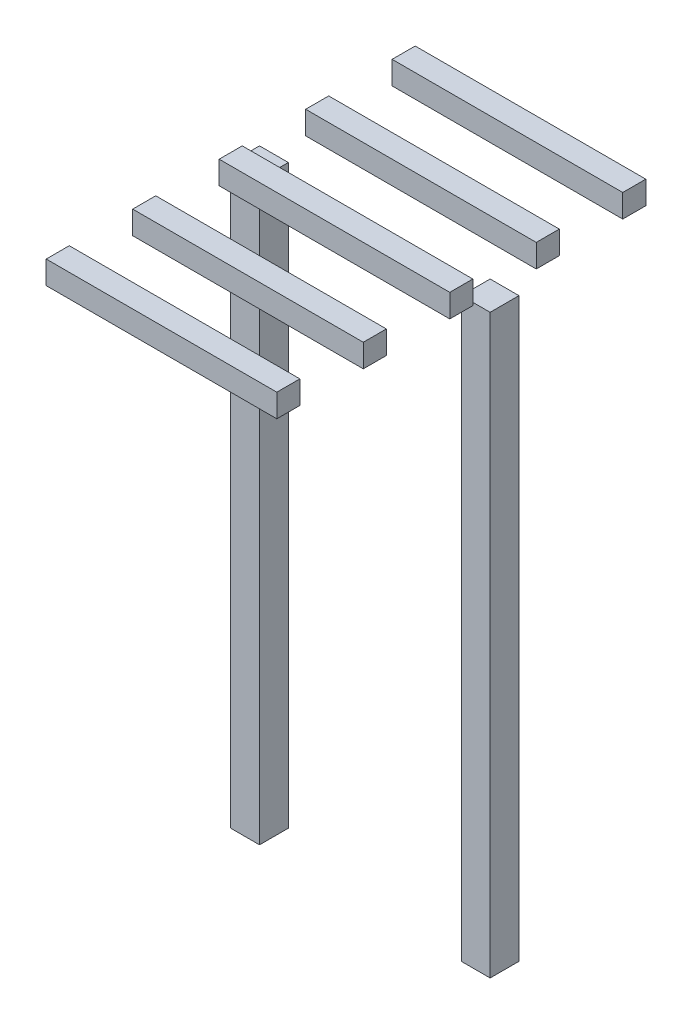
ISO-10303-21;
HEADER;
FILE_DESCRIPTION(('STEP AP214'),'2;1');
FILE_NAME('part.step','',(''),(''),'','','');
FILE_SCHEMA(('AUTOMOTIVE_DESIGN { 1 0 10303 214 1 1 1 1 }'));
ENDSEC;
DATA;
#1=APPLICATION_CONTEXT('core data for automotive mechanical design processes');
#2=APPLICATION_PROTOCOL_DEFINITION('international standard','automotive_design',2000,#1);
#3=PRODUCT_CONTEXT('',#1,'mechanical');
#4=PRODUCT('Part','Part','',(#3));
#5=PRODUCT_RELATED_PRODUCT_CATEGORY('part','',(#4));
#6=PRODUCT_DEFINITION_FORMATION('','',#4);
#7=PRODUCT_DEFINITION_CONTEXT('part definition',#1,'design');
#8=PRODUCT_DEFINITION('design','',#6,#7);
#9=PRODUCT_DEFINITION_SHAPE('','',#8);
#10=(LENGTH_UNIT() NAMED_UNIT(*) SI_UNIT(.MILLI.,.METRE.));
#11=(NAMED_UNIT(*) PLANE_ANGLE_UNIT() SI_UNIT($,.RADIAN.));
#12=(NAMED_UNIT(*) SI_UNIT($,.STERADIAN.) SOLID_ANGLE_UNIT());
#13=UNCERTAINTY_MEASURE_WITH_UNIT(LENGTH_MEASURE(1.E-05),#10,'distance_accuracy_value','');
#14=(GEOMETRIC_REPRESENTATION_CONTEXT(3) GLOBAL_UNCERTAINTY_ASSIGNED_CONTEXT((#13)) GLOBAL_UNIT_ASSIGNED_CONTEXT((#10,
#11,#12)) REPRESENTATION_CONTEXT('',''));
#15=CARTESIAN_POINT('',(0.,0.,0.));
#16=DIRECTION('',(0.,0.,1.));
#17=DIRECTION('',(1.,0.,0.));
#18=AXIS2_PLACEMENT_3D('',#15,#16,#17);
#19=CARTESIAN_POINT('',(400.,2080.,-1460.));
#20=DIRECTION('',(-1.,0.,0.));
#21=DIRECTION('',(0.,0.,1.));
#22=AXIS2_PLACEMENT_3D('',#19,#20,#21);
#23=PLANE('',#22);
#24=DIRECTION('',(0.,0.,-1.));
#25=VECTOR('',#24,1.);
#26=CARTESIAN_POINT('',(400.,2000.,-1460.));
#27=LINE('',#26,#25);
#28=CARTESIAN_POINT('',(400.,2000.,-1460.));
#29=VERTEX_POINT('',#28);
#30=CARTESIAN_POINT('',(400.,2000.,-1540.));
#31=VERTEX_POINT('',#30);
#32=EDGE_CURVE('E115',#29,#31,#27,.T.);
#33=ORIENTED_EDGE('',*,*,#32,.T.);
#34=DIRECTION('',(0.,-1.,0.));
#35=VECTOR('',#34,1.);
#36=CARTESIAN_POINT('',(400.,2080.,-1540.));
#37=LINE('',#36,#35);
#38=CARTESIAN_POINT('',(400.,2080.,-1540.));
#39=VERTEX_POINT('',#38);
#40=EDGE_CURVE('E12',#39,#31,#37,.T.);
#41=ORIENTED_EDGE('',*,*,#40,.F.);
#42=DIRECTION('',(0.,0.,-1.));
#43=VECTOR('',#42,1.);
#44=CARTESIAN_POINT('',(400.,2080.,-1460.));
#45=LINE('',#44,#43);
#46=CARTESIAN_POINT('',(400.,2080.,-1460.));
#47=VERTEX_POINT('',#46);
#48=EDGE_CURVE('E103',#47,#39,#45,.T.);
#49=ORIENTED_EDGE('',*,*,#48,.F.);
#50=DIRECTION('',(0.,-1.,0.));
#51=VECTOR('',#50,1.);
#52=CARTESIAN_POINT('',(400.,2080.,-1460.));
#53=LINE('',#52,#51);
#54=EDGE_CURVE('E111',#47,#29,#53,.T.);
#55=ORIENTED_EDGE('',*,*,#54,.T.);
#56=EDGE_LOOP('',(#33,#41,#49,#55));
#57=FACE_BOUND('',#56,.T.);
#58=ADVANCED_FACE('F52',(#57),#23,.F.);
#59=CARTESIAN_POINT('',(-400.,2080.,-1540.));
#60=DIRECTION('',(0.,0.,1.));
#61=DIRECTION('',(1.,0.,0.));
#62=AXIS2_PLACEMENT_3D('',#59,#60,#61);
#63=PLANE('',#62);
#64=DIRECTION('',(-1.,0.,0.));
#65=VECTOR('',#64,1.);
#66=CARTESIAN_POINT('',(-400.,2000.,-1540.));
#67=LINE('',#66,#65);
#68=CARTESIAN_POINT('',(-400.,2000.,-1540.));
#69=VERTEX_POINT('',#68);
#70=EDGE_CURVE('E107',#31,#69,#67,.T.);
#71=ORIENTED_EDGE('',*,*,#70,.T.);
#72=DIRECTION('',(0.,-1.,0.));
#73=VECTOR('',#72,1.);
#74=CARTESIAN_POINT('',(-400.,2080.,-1540.));
#75=LINE('',#74,#73);
#76=CARTESIAN_POINT('',(-400.,2080.,-1540.));
#77=VERTEX_POINT('',#76);
#78=EDGE_CURVE('E60',#77,#69,#75,.T.);
#79=ORIENTED_EDGE('',*,*,#78,.F.);
#80=DIRECTION('',(-1.,0.,0.));
#81=VECTOR('',#80,1.);
#82=CARTESIAN_POINT('',(-400.,2080.,-1540.));
#83=LINE('',#82,#81);
#84=EDGE_CURVE('E98',#39,#77,#83,.T.);
#85=ORIENTED_EDGE('',*,*,#84,.F.);
#86=ORIENTED_EDGE('',*,*,#40,.T.);
#87=EDGE_LOOP('',(#71,#79,#85,#86));
#88=FACE_BOUND('',#87,.T.);
#89=ADVANCED_FACE('F106',(#88),#63,.F.);
#90=CARTESIAN_POINT('',(-400.,2080.,-1460.));
#91=DIRECTION('',(1.,0.,0.));
#92=DIRECTION('',(0.,0.,-1.));
#93=AXIS2_PLACEMENT_3D('',#90,#91,#92);
#94=PLANE('',#93);
#95=DIRECTION('',(0.,0.,1.));
#96=VECTOR('',#95,1.);
#97=CARTESIAN_POINT('',(-400.,2000.,-1460.));
#98=LINE('',#97,#96);
#99=CARTESIAN_POINT('',(-400.,2000.,-1460.));
#100=VERTEX_POINT('',#99);
#101=EDGE_CURVE('E85',#69,#100,#98,.T.);
#102=ORIENTED_EDGE('',*,*,#101,.T.);
#103=DIRECTION('',(0.,-1.,0.));
#104=VECTOR('',#103,1.);
#105=CARTESIAN_POINT('',(-400.,2080.,-1460.));
#106=LINE('',#105,#104);
#107=CARTESIAN_POINT('',(-400.,2080.,-1460.));
#108=VERTEX_POINT('',#107);
#109=EDGE_CURVE('E108',#108,#100,#106,.T.);
#110=ORIENTED_EDGE('',*,*,#109,.F.);
#111=DIRECTION('',(0.,0.,1.));
#112=VECTOR('',#111,1.);
#113=CARTESIAN_POINT('',(-400.,2080.,-1460.));
#114=LINE('',#113,#112);
#115=EDGE_CURVE('E101',#77,#108,#114,.T.);
#116=ORIENTED_EDGE('',*,*,#115,.F.);
#117=ORIENTED_EDGE('',*,*,#78,.T.);
#118=EDGE_LOOP('',(#102,#110,#116,#117));
#119=FACE_BOUND('',#118,.T.);
#120=ADVANCED_FACE('F109',(#119),#94,.F.);
#121=CARTESIAN_POINT('',(-400.,2080.,-1460.));
#122=DIRECTION('',(0.,0.,-1.));
#123=DIRECTION('',(-1.,0.,0.));
#124=AXIS2_PLACEMENT_3D('',#121,#122,#123);
#125=PLANE('',#124);
#126=DIRECTION('',(1.,0.,0.));
#127=VECTOR('',#126,1.);
#128=CARTESIAN_POINT('',(-400.,2000.,-1460.));
#129=LINE('',#128,#127);
#130=EDGE_CURVE('E91',#100,#29,#129,.T.);
#131=ORIENTED_EDGE('',*,*,#130,.T.);
#132=ORIENTED_EDGE('',*,*,#54,.F.);
#133=DIRECTION('',(1.,0.,0.));
#134=VECTOR('',#133,1.);
#135=CARTESIAN_POINT('',(-400.,2080.,-1460.));
#136=LINE('',#135,#134);
#137=EDGE_CURVE('E68',#108,#47,#136,.T.);
#138=ORIENTED_EDGE('',*,*,#137,.F.);
#139=ORIENTED_EDGE('',*,*,#109,.T.);
#140=EDGE_LOOP('',(#131,#132,#138,#139));
#141=FACE_BOUND('',#140,.T.);
#142=ADVANCED_FACE('F122',(#141),#125,.F.);
#143=CARTESIAN_POINT('',(0.,2080.,0.));
#144=DIRECTION('',(0.,-1.,0.));
#145=DIRECTION('',(0.,0.,-1.));
#146=AXIS2_PLACEMENT_3D('',#143,#144,#145);
#147=PLANE('',#146);
#148=ORIENTED_EDGE('',*,*,#48,.T.);
#149=ORIENTED_EDGE('',*,*,#84,.T.);
#150=ORIENTED_EDGE('',*,*,#115,.T.);
#151=ORIENTED_EDGE('',*,*,#137,.T.);
#152=EDGE_LOOP('',(#148,#149,#150,#151));
#153=FACE_BOUND('',#152,.T.);
#154=ADVANCED_FACE('F99',(#153),#147,.F.);
#155=CARTESIAN_POINT('',(0.,2000.,0.));
#156=DIRECTION('',(0.,-1.,0.));
#157=DIRECTION('',(0.,0.,-1.));
#158=AXIS2_PLACEMENT_3D('',#155,#156,#157);
#159=PLANE('',#158);
#160=ORIENTED_EDGE('',*,*,#32,.F.);
#161=ORIENTED_EDGE('',*,*,#130,.F.);
#162=ORIENTED_EDGE('',*,*,#101,.F.);
#163=ORIENTED_EDGE('',*,*,#70,.F.);
#164=EDGE_LOOP('',(#160,#161,#162,#163));
#165=FACE_BOUND('',#164,.T.);
#166=ADVANCED_FACE('F125',(#165),#159,.T.);
#167=CLOSED_SHELL('',(#58,#89,#120,#142,#154,#166));
#168=MANIFOLD_SOLID_BREP('B2',#167);
#169=CARTESIAN_POINT('',(400.,2080.,-1160.));
#170=DIRECTION('',(-1.,0.,0.));
#171=DIRECTION('',(0.,0.,1.));
#172=AXIS2_PLACEMENT_3D('',#169,#170,#171);
#173=PLANE('',#172);
#174=DIRECTION('',(0.,0.,-1.));
#175=VECTOR('',#174,1.);
#176=CARTESIAN_POINT('',(400.,2000.,-1160.));
#177=LINE('',#176,#175);
#178=CARTESIAN_POINT('',(400.,2000.,-1160.));
#179=VERTEX_POINT('',#178);
#180=CARTESIAN_POINT('',(400.,2000.,-1240.));
#181=VERTEX_POINT('',#180);
#182=EDGE_CURVE('E249',#179,#181,#177,.T.);
#183=ORIENTED_EDGE('',*,*,#182,.T.);
#184=DIRECTION('',(0.,-1.,0.));
#185=VECTOR('',#184,1.);
#186=CARTESIAN_POINT('',(400.,2080.,-1240.));
#187=LINE('',#186,#185);
#188=CARTESIAN_POINT('',(400.,2080.,-1240.));
#189=VERTEX_POINT('',#188);
#190=EDGE_CURVE('E50',#189,#181,#187,.T.);
#191=ORIENTED_EDGE('',*,*,#190,.F.);
#192=DIRECTION('',(0.,0.,-1.));
#193=VECTOR('',#192,1.);
#194=CARTESIAN_POINT('',(400.,2080.,-1160.));
#195=LINE('',#194,#193);
#196=CARTESIAN_POINT('',(400.,2080.,-1160.));
#197=VERTEX_POINT('',#196);
#198=EDGE_CURVE('E237',#197,#189,#195,.T.);
#199=ORIENTED_EDGE('',*,*,#198,.F.);
#200=DIRECTION('',(0.,-1.,0.));
#201=VECTOR('',#200,1.);
#202=CARTESIAN_POINT('',(400.,2080.,-1160.));
#203=LINE('',#202,#201);
#204=EDGE_CURVE('E245',#197,#179,#203,.T.);
#205=ORIENTED_EDGE('',*,*,#204,.T.);
#206=EDGE_LOOP('',(#183,#191,#199,#205));
#207=FACE_BOUND('',#206,.T.);
#208=ADVANCED_FACE('F186',(#207),#173,.F.);
#209=CARTESIAN_POINT('',(-400.,2080.,-1240.));
#210=DIRECTION('',(0.,0.,1.));
#211=DIRECTION('',(1.,0.,0.));
#212=AXIS2_PLACEMENT_3D('',#209,#210,#211);
#213=PLANE('',#212);
#214=DIRECTION('',(-1.,0.,0.));
#215=VECTOR('',#214,1.);
#216=CARTESIAN_POINT('',(-400.,2000.,-1240.));
#217=LINE('',#216,#215);
#218=CARTESIAN_POINT('',(-400.,2000.,-1240.));
#219=VERTEX_POINT('',#218);
#220=EDGE_CURVE('E241',#181,#219,#217,.T.);
#221=ORIENTED_EDGE('',*,*,#220,.T.);
#222=DIRECTION('',(0.,-1.,0.));
#223=VECTOR('',#222,1.);
#224=CARTESIAN_POINT('',(-400.,2080.,-1240.));
#225=LINE('',#224,#223);
#226=CARTESIAN_POINT('',(-400.,2080.,-1240.));
#227=VERTEX_POINT('',#226);
#228=EDGE_CURVE('E194',#227,#219,#225,.T.);
#229=ORIENTED_EDGE('',*,*,#228,.F.);
#230=DIRECTION('',(-1.,0.,0.));
#231=VECTOR('',#230,1.);
#232=CARTESIAN_POINT('',(-400.,2080.,-1240.));
#233=LINE('',#232,#231);
#234=EDGE_CURVE('E232',#189,#227,#233,.T.);
#235=ORIENTED_EDGE('',*,*,#234,.F.);
#236=ORIENTED_EDGE('',*,*,#190,.T.);
#237=EDGE_LOOP('',(#221,#229,#235,#236));
#238=FACE_BOUND('',#237,.T.);
#239=ADVANCED_FACE('F240',(#238),#213,.F.);
#240=CARTESIAN_POINT('',(-400.,2080.,-1160.));
#241=DIRECTION('',(1.,0.,0.));
#242=DIRECTION('',(0.,0.,-1.));
#243=AXIS2_PLACEMENT_3D('',#240,#241,#242);
#244=PLANE('',#243);
#245=DIRECTION('',(0.,0.,1.));
#246=VECTOR('',#245,1.);
#247=CARTESIAN_POINT('',(-400.,2000.,-1160.));
#248=LINE('',#247,#246);
#249=CARTESIAN_POINT('',(-400.,2000.,-1160.));
#250=VERTEX_POINT('',#249);
#251=EDGE_CURVE('E219',#219,#250,#248,.T.);
#252=ORIENTED_EDGE('',*,*,#251,.T.);
#253=DIRECTION('',(0.,-1.,0.));
#254=VECTOR('',#253,1.);
#255=CARTESIAN_POINT('',(-400.,2080.,-1160.));
#256=LINE('',#255,#254);
#257=CARTESIAN_POINT('',(-400.,2080.,-1160.));
#258=VERTEX_POINT('',#257);
#259=EDGE_CURVE('E242',#258,#250,#256,.T.);
#260=ORIENTED_EDGE('',*,*,#259,.F.);
#261=DIRECTION('',(0.,0.,1.));
#262=VECTOR('',#261,1.);
#263=CARTESIAN_POINT('',(-400.,2080.,-1160.));
#264=LINE('',#263,#262);
#265=EDGE_CURVE('E235',#227,#258,#264,.T.);
#266=ORIENTED_EDGE('',*,*,#265,.F.);
#267=ORIENTED_EDGE('',*,*,#228,.T.);
#268=EDGE_LOOP('',(#252,#260,#266,#267));
#269=FACE_BOUND('',#268,.T.);
#270=ADVANCED_FACE('F243',(#269),#244,.F.);
#271=CARTESIAN_POINT('',(-400.,2080.,-1160.));
#272=DIRECTION('',(0.,0.,-1.));
#273=DIRECTION('',(-1.,0.,0.));
#274=AXIS2_PLACEMENT_3D('',#271,#272,#273);
#275=PLANE('',#274);
#276=DIRECTION('',(1.,0.,0.));
#277=VECTOR('',#276,1.);
#278=CARTESIAN_POINT('',(-400.,2000.,-1160.));
#279=LINE('',#278,#277);
#280=EDGE_CURVE('E225',#250,#179,#279,.T.);
#281=ORIENTED_EDGE('',*,*,#280,.T.);
#282=ORIENTED_EDGE('',*,*,#204,.F.);
#283=DIRECTION('',(1.,0.,0.));
#284=VECTOR('',#283,1.);
#285=CARTESIAN_POINT('',(-400.,2080.,-1160.));
#286=LINE('',#285,#284);
#287=EDGE_CURVE('E202',#258,#197,#286,.T.);
#288=ORIENTED_EDGE('',*,*,#287,.F.);
#289=ORIENTED_EDGE('',*,*,#259,.T.);
#290=EDGE_LOOP('',(#281,#282,#288,#289));
#291=FACE_BOUND('',#290,.T.);
#292=ADVANCED_FACE('F256',(#291),#275,.F.);
#293=CARTESIAN_POINT('',(0.,2080.,0.));
#294=DIRECTION('',(0.,-1.,0.));
#295=DIRECTION('',(0.,0.,-1.));
#296=AXIS2_PLACEMENT_3D('',#293,#294,#295);
#297=PLANE('',#296);
#298=ORIENTED_EDGE('',*,*,#198,.T.);
#299=ORIENTED_EDGE('',*,*,#234,.T.);
#300=ORIENTED_EDGE('',*,*,#265,.T.);
#301=ORIENTED_EDGE('',*,*,#287,.T.);
#302=EDGE_LOOP('',(#298,#299,#300,#301));
#303=FACE_BOUND('',#302,.T.);
#304=ADVANCED_FACE('F233',(#303),#297,.F.);
#305=CARTESIAN_POINT('',(0.,2000.,0.));
#306=DIRECTION('',(0.,-1.,0.));
#307=DIRECTION('',(0.,0.,-1.));
#308=AXIS2_PLACEMENT_3D('',#305,#306,#307);
#309=PLANE('',#308);
#310=ORIENTED_EDGE('',*,*,#182,.F.);
#311=ORIENTED_EDGE('',*,*,#280,.F.);
#312=ORIENTED_EDGE('',*,*,#251,.F.);
#313=ORIENTED_EDGE('',*,*,#220,.F.);
#314=EDGE_LOOP('',(#310,#311,#312,#313));
#315=FACE_BOUND('',#314,.T.);
#316=ADVANCED_FACE('F259',(#315),#309,.T.);
#317=CLOSED_SHELL('',(#208,#239,#270,#292,#304,#316));
#318=MANIFOLD_SOLID_BREP('B6',#317);
#319=CARTESIAN_POINT('',(400.,2080.,-860.));
#320=DIRECTION('',(-1.,0.,0.));
#321=DIRECTION('',(0.,0.,1.));
#322=AXIS2_PLACEMENT_3D('',#319,#320,#321);
#323=PLANE('',#322);
#324=DIRECTION('',(0.,0.,-1.));
#325=VECTOR('',#324,1.);
#326=CARTESIAN_POINT('',(400.,2000.,-860.));
#327=LINE('',#326,#325);
#328=CARTESIAN_POINT('',(400.,2000.,-860.));
#329=VERTEX_POINT('',#328);
#330=CARTESIAN_POINT('',(400.,2000.,-940.));
#331=VERTEX_POINT('',#330);
#332=EDGE_CURVE('E383',#329,#331,#327,.T.);
#333=ORIENTED_EDGE('',*,*,#332,.T.);
#334=DIRECTION('',(0.,-1.,0.));
#335=VECTOR('',#334,1.);
#336=CARTESIAN_POINT('',(400.,2080.,-940.));
#337=LINE('',#336,#335);
#338=CARTESIAN_POINT('',(400.,2080.,-940.));
#339=VERTEX_POINT('',#338);
#340=EDGE_CURVE('E184',#339,#331,#337,.T.);
#341=ORIENTED_EDGE('',*,*,#340,.F.);
#342=DIRECTION('',(0.,0.,-1.));
#343=VECTOR('',#342,1.);
#344=CARTESIAN_POINT('',(400.,2080.,-860.));
#345=LINE('',#344,#343);
#346=CARTESIAN_POINT('',(400.,2080.,-860.));
#347=VERTEX_POINT('',#346);
#348=EDGE_CURVE('E371',#347,#339,#345,.T.);
#349=ORIENTED_EDGE('',*,*,#348,.F.);
#350=DIRECTION('',(0.,-1.,0.));
#351=VECTOR('',#350,1.);
#352=CARTESIAN_POINT('',(400.,2080.,-860.));
#353=LINE('',#352,#351);
#354=EDGE_CURVE('E379',#347,#329,#353,.T.);
#355=ORIENTED_EDGE('',*,*,#354,.T.);
#356=EDGE_LOOP('',(#333,#341,#349,#355));
#357=FACE_BOUND('',#356,.T.);
#358=ADVANCED_FACE('F320',(#357),#323,.F.);
#359=CARTESIAN_POINT('',(-400.,2080.,-940.));
#360=DIRECTION('',(0.,0.,1.));
#361=DIRECTION('',(1.,0.,0.));
#362=AXIS2_PLACEMENT_3D('',#359,#360,#361);
#363=PLANE('',#362);
#364=DIRECTION('',(-1.,0.,0.));
#365=VECTOR('',#364,1.);
#366=CARTESIAN_POINT('',(-400.,2000.,-940.));
#367=LINE('',#366,#365);
#368=CARTESIAN_POINT('',(-400.,2000.,-940.));
#369=VERTEX_POINT('',#368);
#370=EDGE_CURVE('E375',#331,#369,#367,.T.);
#371=ORIENTED_EDGE('',*,*,#370,.T.);
#372=DIRECTION('',(0.,-1.,0.));
#373=VECTOR('',#372,1.);
#374=CARTESIAN_POINT('',(-400.,2080.,-940.));
#375=LINE('',#374,#373);
#376=CARTESIAN_POINT('',(-400.,2080.,-940.));
#377=VERTEX_POINT('',#376);
#378=EDGE_CURVE('E328',#377,#369,#375,.T.);
#379=ORIENTED_EDGE('',*,*,#378,.F.);
#380=DIRECTION('',(-1.,0.,0.));
#381=VECTOR('',#380,1.);
#382=CARTESIAN_POINT('',(-400.,2080.,-940.));
#383=LINE('',#382,#381);
#384=EDGE_CURVE('E366',#339,#377,#383,.T.);
#385=ORIENTED_EDGE('',*,*,#384,.F.);
#386=ORIENTED_EDGE('',*,*,#340,.T.);
#387=EDGE_LOOP('',(#371,#379,#385,#386));
#388=FACE_BOUND('',#387,.T.);
#389=ADVANCED_FACE('F374',(#388),#363,.F.);
#390=CARTESIAN_POINT('',(-400.,2080.,-860.));
#391=DIRECTION('',(1.,0.,0.));
#392=DIRECTION('',(0.,0.,-1.));
#393=AXIS2_PLACEMENT_3D('',#390,#391,#392);
#394=PLANE('',#393);
#395=DIRECTION('',(0.,0.,1.));
#396=VECTOR('',#395,1.);
#397=CARTESIAN_POINT('',(-400.,2000.,-860.));
#398=LINE('',#397,#396);
#399=CARTESIAN_POINT('',(-400.,2000.,-860.));
#400=VERTEX_POINT('',#399);
#401=EDGE_CURVE('E353',#369,#400,#398,.T.);
#402=ORIENTED_EDGE('',*,*,#401,.T.);
#403=DIRECTION('',(0.,-1.,0.));
#404=VECTOR('',#403,1.);
#405=CARTESIAN_POINT('',(-400.,2080.,-860.));
#406=LINE('',#405,#404);
#407=CARTESIAN_POINT('',(-400.,2080.,-860.));
#408=VERTEX_POINT('',#407);
#409=EDGE_CURVE('E376',#408,#400,#406,.T.);
#410=ORIENTED_EDGE('',*,*,#409,.F.);
#411=DIRECTION('',(0.,0.,1.));
#412=VECTOR('',#411,1.);
#413=CARTESIAN_POINT('',(-400.,2080.,-860.));
#414=LINE('',#413,#412);
#415=EDGE_CURVE('E369',#377,#408,#414,.T.);
#416=ORIENTED_EDGE('',*,*,#415,.F.);
#417=ORIENTED_EDGE('',*,*,#378,.T.);
#418=EDGE_LOOP('',(#402,#410,#416,#417));
#419=FACE_BOUND('',#418,.T.);
#420=ADVANCED_FACE('F377',(#419),#394,.F.);
#421=CARTESIAN_POINT('',(-400.,2080.,-860.));
#422=DIRECTION('',(0.,0.,-1.));
#423=DIRECTION('',(-1.,0.,0.));
#424=AXIS2_PLACEMENT_3D('',#421,#422,#423);
#425=PLANE('',#424);
#426=DIRECTION('',(1.,0.,0.));
#427=VECTOR('',#426,1.);
#428=CARTESIAN_POINT('',(-400.,2000.,-860.));
#429=LINE('',#428,#427);
#430=EDGE_CURVE('E359',#400,#329,#429,.T.);
#431=ORIENTED_EDGE('',*,*,#430,.T.);
#432=ORIENTED_EDGE('',*,*,#354,.F.);
#433=DIRECTION('',(1.,0.,0.));
#434=VECTOR('',#433,1.);
#435=CARTESIAN_POINT('',(-400.,2080.,-860.));
#436=LINE('',#435,#434);
#437=EDGE_CURVE('E336',#408,#347,#436,.T.);
#438=ORIENTED_EDGE('',*,*,#437,.F.);
#439=ORIENTED_EDGE('',*,*,#409,.T.);
#440=EDGE_LOOP('',(#431,#432,#438,#439));
#441=FACE_BOUND('',#440,.T.);
#442=ADVANCED_FACE('F390',(#441),#425,.F.);
#443=CARTESIAN_POINT('',(0.,2080.,0.));
#444=DIRECTION('',(0.,-1.,0.));
#445=DIRECTION('',(0.,0.,-1.));
#446=AXIS2_PLACEMENT_3D('',#443,#444,#445);
#447=PLANE('',#446);
#448=ORIENTED_EDGE('',*,*,#348,.T.);
#449=ORIENTED_EDGE('',*,*,#384,.T.);
#450=ORIENTED_EDGE('',*,*,#415,.T.);
#451=ORIENTED_EDGE('',*,*,#437,.T.);
#452=EDGE_LOOP('',(#448,#449,#450,#451));
#453=FACE_BOUND('',#452,.T.);
#454=ADVANCED_FACE('F367',(#453),#447,.F.);
#455=CARTESIAN_POINT('',(0.,2000.,0.));
#456=DIRECTION('',(0.,-1.,0.));
#457=DIRECTION('',(0.,0.,-1.));
#458=AXIS2_PLACEMENT_3D('',#455,#456,#457);
#459=PLANE('',#458);
#460=ORIENTED_EDGE('',*,*,#332,.F.);
#461=ORIENTED_EDGE('',*,*,#430,.F.);
#462=ORIENTED_EDGE('',*,*,#401,.F.);
#463=ORIENTED_EDGE('',*,*,#370,.F.);
#464=EDGE_LOOP('',(#460,#461,#462,#463));
#465=FACE_BOUND('',#464,.T.);
#466=ADVANCED_FACE('F393',(#465),#459,.T.);
#467=CLOSED_SHELL('',(#358,#389,#420,#442,#454,#466));
#468=MANIFOLD_SOLID_BREP('B44',#467);
#469=CARTESIAN_POINT('',(400.,2080.,-560.));
#470=DIRECTION('',(-1.,0.,0.));
#471=DIRECTION('',(0.,0.,1.));
#472=AXIS2_PLACEMENT_3D('',#469,#470,#471);
#473=PLANE('',#472);
#474=DIRECTION('',(0.,0.,-1.));
#475=VECTOR('',#474,1.);
#476=CARTESIAN_POINT('',(400.,2000.,-560.));
#477=LINE('',#476,#475);
#478=CARTESIAN_POINT('',(400.,2000.,-560.));
#479=VERTEX_POINT('',#478);
#480=CARTESIAN_POINT('',(400.,2000.,-640.));
#481=VERTEX_POINT('',#480);
#482=EDGE_CURVE('E517',#479,#481,#477,.T.);
#483=ORIENTED_EDGE('',*,*,#482,.T.);
#484=DIRECTION('',(0.,-1.,0.));
#485=VECTOR('',#484,1.);
#486=CARTESIAN_POINT('',(400.,2080.,-640.));
#487=LINE('',#486,#485);
#488=CARTESIAN_POINT('',(400.,2080.,-640.));
#489=VERTEX_POINT('',#488);
#490=EDGE_CURVE('E318',#489,#481,#487,.T.);
#491=ORIENTED_EDGE('',*,*,#490,.F.);
#492=DIRECTION('',(0.,0.,-1.));
#493=VECTOR('',#492,1.);
#494=CARTESIAN_POINT('',(400.,2080.,-560.));
#495=LINE('',#494,#493);
#496=CARTESIAN_POINT('',(400.,2080.,-560.));
#497=VERTEX_POINT('',#496);
#498=EDGE_CURVE('E505',#497,#489,#495,.T.);
#499=ORIENTED_EDGE('',*,*,#498,.F.);
#500=DIRECTION('',(0.,-1.,0.));
#501=VECTOR('',#500,1.);
#502=CARTESIAN_POINT('',(400.,2080.,-560.));
#503=LINE('',#502,#501);
#504=EDGE_CURVE('E513',#497,#479,#503,.T.);
#505=ORIENTED_EDGE('',*,*,#504,.T.);
#506=EDGE_LOOP('',(#483,#491,#499,#505));
#507=FACE_BOUND('',#506,.T.);
#508=ADVANCED_FACE('F454',(#507),#473,.F.);
#509=CARTESIAN_POINT('',(-400.,2080.,-640.));
#510=DIRECTION('',(0.,0.,1.));
#511=DIRECTION('',(1.,0.,0.));
#512=AXIS2_PLACEMENT_3D('',#509,#510,#511);
#513=PLANE('',#512);
#514=DIRECTION('',(-1.,0.,0.));
#515=VECTOR('',#514,1.);
#516=CARTESIAN_POINT('',(-400.,2000.,-640.));
#517=LINE('',#516,#515);
#518=CARTESIAN_POINT('',(-400.,2000.,-640.));
#519=VERTEX_POINT('',#518);
#520=EDGE_CURVE('E509',#481,#519,#517,.T.);
#521=ORIENTED_EDGE('',*,*,#520,.T.);
#522=DIRECTION('',(0.,-1.,0.));
#523=VECTOR('',#522,1.);
#524=CARTESIAN_POINT('',(-400.,2080.,-640.));
#525=LINE('',#524,#523);
#526=CARTESIAN_POINT('',(-400.,2080.,-640.));
#527=VERTEX_POINT('',#526);
#528=EDGE_CURVE('E462',#527,#519,#525,.T.);
#529=ORIENTED_EDGE('',*,*,#528,.F.);
#530=DIRECTION('',(-1.,0.,0.));
#531=VECTOR('',#530,1.);
#532=CARTESIAN_POINT('',(-400.,2080.,-640.));
#533=LINE('',#532,#531);
#534=EDGE_CURVE('E500',#489,#527,#533,.T.);
#535=ORIENTED_EDGE('',*,*,#534,.F.);
#536=ORIENTED_EDGE('',*,*,#490,.T.);
#537=EDGE_LOOP('',(#521,#529,#535,#536));
#538=FACE_BOUND('',#537,.T.);
#539=ADVANCED_FACE('F508',(#538),#513,.F.);
#540=CARTESIAN_POINT('',(-400.,2080.,-560.));
#541=DIRECTION('',(1.,0.,0.));
#542=DIRECTION('',(0.,0.,-1.));
#543=AXIS2_PLACEMENT_3D('',#540,#541,#542);
#544=PLANE('',#543);
#545=DIRECTION('',(0.,0.,1.));
#546=VECTOR('',#545,1.);
#547=CARTESIAN_POINT('',(-400.,2000.,-560.));
#548=LINE('',#547,#546);
#549=CARTESIAN_POINT('',(-400.,2000.,-560.));
#550=VERTEX_POINT('',#549);
#551=EDGE_CURVE('E487',#519,#550,#548,.T.);
#552=ORIENTED_EDGE('',*,*,#551,.T.);
#553=DIRECTION('',(0.,-1.,0.));
#554=VECTOR('',#553,1.);
#555=CARTESIAN_POINT('',(-400.,2080.,-560.));
#556=LINE('',#555,#554);
#557=CARTESIAN_POINT('',(-400.,2080.,-560.));
#558=VERTEX_POINT('',#557);
#559=EDGE_CURVE('E510',#558,#550,#556,.T.);
#560=ORIENTED_EDGE('',*,*,#559,.F.);
#561=DIRECTION('',(0.,0.,1.));
#562=VECTOR('',#561,1.);
#563=CARTESIAN_POINT('',(-400.,2080.,-560.));
#564=LINE('',#563,#562);
#565=EDGE_CURVE('E503',#527,#558,#564,.T.);
#566=ORIENTED_EDGE('',*,*,#565,.F.);
#567=ORIENTED_EDGE('',*,*,#528,.T.);
#568=EDGE_LOOP('',(#552,#560,#566,#567));
#569=FACE_BOUND('',#568,.T.);
#570=ADVANCED_FACE('F511',(#569),#544,.F.);
#571=CARTESIAN_POINT('',(-400.,2080.,-560.));
#572=DIRECTION('',(0.,0.,-1.));
#573=DIRECTION('',(-1.,0.,0.));
#574=AXIS2_PLACEMENT_3D('',#571,#572,#573);
#575=PLANE('',#574);
#576=DIRECTION('',(1.,0.,0.));
#577=VECTOR('',#576,1.);
#578=CARTESIAN_POINT('',(-400.,2000.,-560.));
#579=LINE('',#578,#577);
#580=EDGE_CURVE('E493',#550,#479,#579,.T.);
#581=ORIENTED_EDGE('',*,*,#580,.T.);
#582=ORIENTED_EDGE('',*,*,#504,.F.);
#583=DIRECTION('',(1.,0.,0.));
#584=VECTOR('',#583,1.);
#585=CARTESIAN_POINT('',(-400.,2080.,-560.));
#586=LINE('',#585,#584);
#587=EDGE_CURVE('E470',#558,#497,#586,.T.);
#588=ORIENTED_EDGE('',*,*,#587,.F.);
#589=ORIENTED_EDGE('',*,*,#559,.T.);
#590=EDGE_LOOP('',(#581,#582,#588,#589));
#591=FACE_BOUND('',#590,.T.);
#592=ADVANCED_FACE('F524',(#591),#575,.F.);
#593=CARTESIAN_POINT('',(0.,2080.,0.));
#594=DIRECTION('',(0.,-1.,0.));
#595=DIRECTION('',(0.,0.,-1.));
#596=AXIS2_PLACEMENT_3D('',#593,#594,#595);
#597=PLANE('',#596);
#598=ORIENTED_EDGE('',*,*,#498,.T.);
#599=ORIENTED_EDGE('',*,*,#534,.T.);
#600=ORIENTED_EDGE('',*,*,#565,.T.);
#601=ORIENTED_EDGE('',*,*,#587,.T.);
#602=EDGE_LOOP('',(#598,#599,#600,#601));
#603=FACE_BOUND('',#602,.T.);
#604=ADVANCED_FACE('F501',(#603),#597,.F.);
#605=CARTESIAN_POINT('',(0.,2000.,0.));
#606=DIRECTION('',(0.,-1.,0.));
#607=DIRECTION('',(0.,0.,-1.));
#608=AXIS2_PLACEMENT_3D('',#605,#606,#607);
#609=PLANE('',#608);
#610=ORIENTED_EDGE('',*,*,#482,.F.);
#611=ORIENTED_EDGE('',*,*,#580,.F.);
#612=ORIENTED_EDGE('',*,*,#551,.F.);
#613=ORIENTED_EDGE('',*,*,#520,.F.);
#614=EDGE_LOOP('',(#610,#611,#612,#613));
#615=FACE_BOUND('',#614,.T.);
#616=ADVANCED_FACE('F527',(#615),#609,.T.);
#617=CLOSED_SHELL('',(#508,#539,#570,#592,#604,#616));
#618=MANIFOLD_SOLID_BREP('B178',#617);
#619=CARTESIAN_POINT('',(400.,2080.,-260.));
#620=DIRECTION('',(-1.,0.,0.));
#621=DIRECTION('',(0.,0.,1.));
#622=AXIS2_PLACEMENT_3D('',#619,#620,#621);
#623=PLANE('',#622);
#624=DIRECTION('',(0.,0.,-1.));
#625=VECTOR('',#624,1.);
#626=CARTESIAN_POINT('',(400.,2000.,-260.));
#627=LINE('',#626,#625);
#628=CARTESIAN_POINT('',(400.,2000.,-260.));
#629=VERTEX_POINT('',#628);
#630=CARTESIAN_POINT('',(400.,2000.,-340.));
#631=VERTEX_POINT('',#630);
#632=EDGE_CURVE('E651',#629,#631,#627,.T.);
#633=ORIENTED_EDGE('',*,*,#632,.T.);
#634=DIRECTION('',(0.,-1.,0.));
#635=VECTOR('',#634,1.);
#636=CARTESIAN_POINT('',(400.,2080.,-340.));
#637=LINE('',#636,#635);
#638=CARTESIAN_POINT('',(400.,2080.,-340.));
#639=VERTEX_POINT('',#638);
#640=EDGE_CURVE('E452',#639,#631,#637,.T.);
#641=ORIENTED_EDGE('',*,*,#640,.F.);
#642=DIRECTION('',(0.,0.,-1.));
#643=VECTOR('',#642,1.);
#644=CARTESIAN_POINT('',(400.,2080.,-260.));
#645=LINE('',#644,#643);
#646=CARTESIAN_POINT('',(400.,2080.,-260.));
#647=VERTEX_POINT('',#646);
#648=EDGE_CURVE('E639',#647,#639,#645,.T.);
#649=ORIENTED_EDGE('',*,*,#648,.F.);
#650=DIRECTION('',(0.,-1.,0.));
#651=VECTOR('',#650,1.);
#652=CARTESIAN_POINT('',(400.,2080.,-260.));
#653=LINE('',#652,#651);
#654=EDGE_CURVE('E647',#647,#629,#653,.T.);
#655=ORIENTED_EDGE('',*,*,#654,.T.);
#656=EDGE_LOOP('',(#633,#641,#649,#655));
#657=FACE_BOUND('',#656,.T.);
#658=ADVANCED_FACE('F588',(#657),#623,.F.);
#659=CARTESIAN_POINT('',(-400.,2080.,-340.));
#660=DIRECTION('',(0.,0.,1.));
#661=DIRECTION('',(1.,0.,0.));
#662=AXIS2_PLACEMENT_3D('',#659,#660,#661);
#663=PLANE('',#662);
#664=DIRECTION('',(-1.,0.,0.));
#665=VECTOR('',#664,1.);
#666=CARTESIAN_POINT('',(-400.,2000.,-340.));
#667=LINE('',#666,#665);
#668=CARTESIAN_POINT('',(-400.,2000.,-340.));
#669=VERTEX_POINT('',#668);
#670=EDGE_CURVE('E643',#631,#669,#667,.T.);
#671=ORIENTED_EDGE('',*,*,#670,.T.);
#672=DIRECTION('',(0.,-1.,0.));
#673=VECTOR('',#672,1.);
#674=CARTESIAN_POINT('',(-400.,2080.,-340.));
#675=LINE('',#674,#673);
#676=CARTESIAN_POINT('',(-400.,2080.,-340.));
#677=VERTEX_POINT('',#676);
#678=EDGE_CURVE('E596',#677,#669,#675,.T.);
#679=ORIENTED_EDGE('',*,*,#678,.F.);
#680=DIRECTION('',(-1.,0.,0.));
#681=VECTOR('',#680,1.);
#682=CARTESIAN_POINT('',(-400.,2080.,-340.));
#683=LINE('',#682,#681);
#684=EDGE_CURVE('E634',#639,#677,#683,.T.);
#685=ORIENTED_EDGE('',*,*,#684,.F.);
#686=ORIENTED_EDGE('',*,*,#640,.T.);
#687=EDGE_LOOP('',(#671,#679,#685,#686));
#688=FACE_BOUND('',#687,.T.);
#689=ADVANCED_FACE('F642',(#688),#663,.F.);
#690=CARTESIAN_POINT('',(-400.,2080.,-260.));
#691=DIRECTION('',(1.,0.,0.));
#692=DIRECTION('',(0.,0.,-1.));
#693=AXIS2_PLACEMENT_3D('',#690,#691,#692);
#694=PLANE('',#693);
#695=DIRECTION('',(0.,0.,1.));
#696=VECTOR('',#695,1.);
#697=CARTESIAN_POINT('',(-400.,2000.,-260.));
#698=LINE('',#697,#696);
#699=CARTESIAN_POINT('',(-400.,2000.,-260.));
#700=VERTEX_POINT('',#699);
#701=EDGE_CURVE('E621',#669,#700,#698,.T.);
#702=ORIENTED_EDGE('',*,*,#701,.T.);
#703=DIRECTION('',(0.,-1.,0.));
#704=VECTOR('',#703,1.);
#705=CARTESIAN_POINT('',(-400.,2080.,-260.));
#706=LINE('',#705,#704);
#707=CARTESIAN_POINT('',(-400.,2080.,-260.));
#708=VERTEX_POINT('',#707);
#709=EDGE_CURVE('E644',#708,#700,#706,.T.);
#710=ORIENTED_EDGE('',*,*,#709,.F.);
#711=DIRECTION('',(0.,0.,1.));
#712=VECTOR('',#711,1.);
#713=CARTESIAN_POINT('',(-400.,2080.,-260.));
#714=LINE('',#713,#712);
#715=EDGE_CURVE('E637',#677,#708,#714,.T.);
#716=ORIENTED_EDGE('',*,*,#715,.F.);
#717=ORIENTED_EDGE('',*,*,#678,.T.);
#718=EDGE_LOOP('',(#702,#710,#716,#717));
#719=FACE_BOUND('',#718,.T.);
#720=ADVANCED_FACE('F645',(#719),#694,.F.);
#721=CARTESIAN_POINT('',(-400.,2080.,-260.));
#722=DIRECTION('',(0.,0.,-1.));
#723=DIRECTION('',(-1.,0.,0.));
#724=AXIS2_PLACEMENT_3D('',#721,#722,#723);
#725=PLANE('',#724);
#726=DIRECTION('',(1.,0.,0.));
#727=VECTOR('',#726,1.);
#728=CARTESIAN_POINT('',(-400.,2000.,-260.));
#729=LINE('',#728,#727);
#730=EDGE_CURVE('E627',#700,#629,#729,.T.);
#731=ORIENTED_EDGE('',*,*,#730,.T.);
#732=ORIENTED_EDGE('',*,*,#654,.F.);
#733=DIRECTION('',(1.,0.,0.));
#734=VECTOR('',#733,1.);
#735=CARTESIAN_POINT('',(-400.,2080.,-260.));
#736=LINE('',#735,#734);
#737=EDGE_CURVE('E604',#708,#647,#736,.T.);
#738=ORIENTED_EDGE('',*,*,#737,.F.);
#739=ORIENTED_EDGE('',*,*,#709,.T.);
#740=EDGE_LOOP('',(#731,#732,#738,#739));
#741=FACE_BOUND('',#740,.T.);
#742=ADVANCED_FACE('F658',(#741),#725,.F.);
#743=CARTESIAN_POINT('',(0.,2080.,0.));
#744=DIRECTION('',(0.,-1.,0.));
#745=DIRECTION('',(0.,0.,-1.));
#746=AXIS2_PLACEMENT_3D('',#743,#744,#745);
#747=PLANE('',#746);
#748=ORIENTED_EDGE('',*,*,#648,.T.);
#749=ORIENTED_EDGE('',*,*,#684,.T.);
#750=ORIENTED_EDGE('',*,*,#715,.T.);
#751=ORIENTED_EDGE('',*,*,#737,.T.);
#752=EDGE_LOOP('',(#748,#749,#750,#751));
#753=FACE_BOUND('',#752,.T.);
#754=ADVANCED_FACE('F635',(#753),#747,.F.);
#755=CARTESIAN_POINT('',(0.,2000.,0.));
#756=DIRECTION('',(0.,-1.,0.));
#757=DIRECTION('',(0.,0.,-1.));
#758=AXIS2_PLACEMENT_3D('',#755,#756,#757);
#759=PLANE('',#758);
#760=ORIENTED_EDGE('',*,*,#632,.F.);
#761=ORIENTED_EDGE('',*,*,#730,.F.);
#762=ORIENTED_EDGE('',*,*,#701,.F.);
#763=ORIENTED_EDGE('',*,*,#670,.F.);
#764=EDGE_LOOP('',(#760,#761,#762,#763));
#765=FACE_BOUND('',#764,.T.);
#766=ADVANCED_FACE('F661',(#765),#759,.T.);
#767=CLOSED_SHELL('',(#658,#689,#720,#742,#754,#766));
#768=MANIFOLD_SOLID_BREP('B312',#767);
#769=CARTESIAN_POINT('',(450.,2000.,-950.));
#770=DIRECTION('',(-1.,0.,0.));
#771=DIRECTION('',(0.,0.,1.));
#772=AXIS2_PLACEMENT_3D('',#769,#770,#771);
#773=PLANE('',#772);
#774=DIRECTION('',(0.,0.,-1.));
#775=VECTOR('',#774,1.);
#776=CARTESIAN_POINT('',(450.,0.,-950.));
#777=LINE('',#776,#775);
#778=CARTESIAN_POINT('',(450.,0.,-950.));
#779=VERTEX_POINT('',#778);
#780=CARTESIAN_POINT('',(450.,0.,-1050.));
#781=VERTEX_POINT('',#780);
#782=EDGE_CURVE('E784',#779,#781,#777,.T.);
#783=ORIENTED_EDGE('',*,*,#782,.T.);
#784=DIRECTION('',(0.,-1.,0.));
#785=VECTOR('',#784,1.);
#786=CARTESIAN_POINT('',(450.,2000.,-1050.));
#787=LINE('',#786,#785);
#788=CARTESIAN_POINT('',(450.,2000.,-1050.));
#789=VERTEX_POINT('',#788);
#790=EDGE_CURVE('E586',#789,#781,#787,.T.);
#791=ORIENTED_EDGE('',*,*,#790,.F.);
#792=DIRECTION('',(0.,0.,-1.));
#793=VECTOR('',#792,1.);
#794=CARTESIAN_POINT('',(450.,2000.,-950.));
#795=LINE('',#794,#793);
#796=CARTESIAN_POINT('',(450.,2000.,-950.));
#797=VERTEX_POINT('',#796);
#798=EDGE_CURVE('E772',#797,#789,#795,.T.);
#799=ORIENTED_EDGE('',*,*,#798,.F.);
#800=DIRECTION('',(0.,-1.,0.));
#801=VECTOR('',#800,1.);
#802=CARTESIAN_POINT('',(450.,2000.,-950.));
#803=LINE('',#802,#801);
#804=EDGE_CURVE('E780',#797,#779,#803,.T.);
#805=ORIENTED_EDGE('',*,*,#804,.T.);
#806=EDGE_LOOP('',(#783,#791,#799,#805));
#807=FACE_BOUND('',#806,.T.);
#808=ADVANCED_FACE('F721',(#807),#773,.F.);
#809=CARTESIAN_POINT('',(350.,2000.,-1050.));
#810=DIRECTION('',(0.,0.,1.));
#811=DIRECTION('',(1.,0.,0.));
#812=AXIS2_PLACEMENT_3D('',#809,#810,#811);
#813=PLANE('',#812);
#814=DIRECTION('',(-1.,0.,0.));
#815=VECTOR('',#814,1.);
#816=CARTESIAN_POINT('',(350.,0.,-1050.));
#817=LINE('',#816,#815);
#818=CARTESIAN_POINT('',(350.,0.,-1050.));
#819=VERTEX_POINT('',#818);
#820=EDGE_CURVE('E776',#781,#819,#817,.T.);
#821=ORIENTED_EDGE('',*,*,#820,.T.);
#822=DIRECTION('',(0.,-1.,0.));
#823=VECTOR('',#822,1.);
#824=CARTESIAN_POINT('',(350.,2000.,-1050.));
#825=LINE('',#824,#823);
#826=CARTESIAN_POINT('',(350.,2000.,-1050.));
#827=VERTEX_POINT('',#826);
#828=EDGE_CURVE('E729',#827,#819,#825,.T.);
#829=ORIENTED_EDGE('',*,*,#828,.F.);
#830=DIRECTION('',(-1.,0.,0.));
#831=VECTOR('',#830,1.);
#832=CARTESIAN_POINT('',(350.,2000.,-1050.));
#833=LINE('',#832,#831);
#834=EDGE_CURVE('E767',#789,#827,#833,.T.);
#835=ORIENTED_EDGE('',*,*,#834,.F.);
#836=ORIENTED_EDGE('',*,*,#790,.T.);
#837=EDGE_LOOP('',(#821,#829,#835,#836));
#838=FACE_BOUND('',#837,.T.);
#839=ADVANCED_FACE('F775',(#838),#813,.F.);
#840=CARTESIAN_POINT('',(350.,2000.,-950.));
#841=DIRECTION('',(1.,0.,0.));
#842=DIRECTION('',(0.,0.,-1.));
#843=AXIS2_PLACEMENT_3D('',#840,#841,#842);
#844=PLANE('',#843);
#845=DIRECTION('',(0.,0.,1.));
#846=VECTOR('',#845,1.);
#847=CARTESIAN_POINT('',(350.,0.,-950.));
#848=LINE('',#847,#846);
#849=CARTESIAN_POINT('',(350.,0.,-950.));
#850=VERTEX_POINT('',#849);
#851=EDGE_CURVE('E754',#819,#850,#848,.T.);
#852=ORIENTED_EDGE('',*,*,#851,.T.);
#853=DIRECTION('',(0.,-1.,0.));
#854=VECTOR('',#853,1.);
#855=CARTESIAN_POINT('',(350.,2000.,-950.));
#856=LINE('',#855,#854);
#857=CARTESIAN_POINT('',(350.,2000.,-950.));
#858=VERTEX_POINT('',#857);
#859=EDGE_CURVE('E777',#858,#850,#856,.T.);
#860=ORIENTED_EDGE('',*,*,#859,.F.);
#861=DIRECTION('',(0.,0.,1.));
#862=VECTOR('',#861,1.);
#863=CARTESIAN_POINT('',(350.,2000.,-950.));
#864=LINE('',#863,#862);
#865=EDGE_CURVE('E770',#827,#858,#864,.T.);
#866=ORIENTED_EDGE('',*,*,#865,.F.);
#867=ORIENTED_EDGE('',*,*,#828,.T.);
#868=EDGE_LOOP('',(#852,#860,#866,#867));
#869=FACE_BOUND('',#868,.T.);
#870=ADVANCED_FACE('F778',(#869),#844,.F.);
#871=CARTESIAN_POINT('',(350.,2000.,-950.));
#872=DIRECTION('',(0.,0.,-1.));
#873=DIRECTION('',(-1.,0.,0.));
#874=AXIS2_PLACEMENT_3D('',#871,#872,#873);
#875=PLANE('',#874);
#876=DIRECTION('',(1.,0.,0.));
#877=VECTOR('',#876,1.);
#878=CARTESIAN_POINT('',(350.,0.,-950.));
#879=LINE('',#878,#877);
#880=EDGE_CURVE('E760',#850,#779,#879,.T.);
#881=ORIENTED_EDGE('',*,*,#880,.T.);
#882=ORIENTED_EDGE('',*,*,#804,.F.);
#883=DIRECTION('',(1.,0.,0.));
#884=VECTOR('',#883,1.);
#885=CARTESIAN_POINT('',(350.,2000.,-950.));
#886=LINE('',#885,#884);
#887=EDGE_CURVE('E737',#858,#797,#886,.T.);
#888=ORIENTED_EDGE('',*,*,#887,.F.);
#889=ORIENTED_EDGE('',*,*,#859,.T.);
#890=EDGE_LOOP('',(#881,#882,#888,#889));
#891=FACE_BOUND('',#890,.T.);
#892=ADVANCED_FACE('F791',(#891),#875,.F.);
#893=CARTESIAN_POINT('',(0.,2000.,0.));
#894=DIRECTION('',(0.,-1.,0.));
#895=DIRECTION('',(0.,0.,-1.));
#896=AXIS2_PLACEMENT_3D('',#893,#894,#895);
#897=PLANE('',#896);
#898=ORIENTED_EDGE('',*,*,#798,.T.);
#899=ORIENTED_EDGE('',*,*,#834,.T.);
#900=ORIENTED_EDGE('',*,*,#865,.T.);
#901=ORIENTED_EDGE('',*,*,#887,.T.);
#902=EDGE_LOOP('',(#898,#899,#900,#901));
#903=FACE_BOUND('',#902,.T.);
#904=ADVANCED_FACE('F768',(#903),#897,.F.);
#905=CARTESIAN_POINT('',(0.,0.,0.));
#906=DIRECTION('',(0.,-1.,0.));
#907=DIRECTION('',(0.,0.,-1.));
#908=AXIS2_PLACEMENT_3D('',#905,#906,#907);
#909=PLANE('',#908);
#910=ORIENTED_EDGE('',*,*,#782,.F.);
#911=ORIENTED_EDGE('',*,*,#880,.F.);
#912=ORIENTED_EDGE('',*,*,#851,.F.);
#913=ORIENTED_EDGE('',*,*,#820,.F.);
#914=EDGE_LOOP('',(#910,#911,#912,#913));
#915=FACE_BOUND('',#914,.T.);
#916=ADVANCED_FACE('F794',(#915),#909,.T.);
#917=CLOSED_SHELL('',(#808,#839,#870,#892,#904,#916));
#918=MANIFOLD_SOLID_BREP('B446',#917);
#919=CARTESIAN_POINT('',(-350.,2000.,-950.));
#920=DIRECTION('',(-1.,0.,0.));
#921=DIRECTION('',(0.,0.,1.));
#922=AXIS2_PLACEMENT_3D('',#919,#920,#921);
#923=PLANE('',#922);
#924=DIRECTION('',(0.,0.,-1.));
#925=VECTOR('',#924,1.);
#926=CARTESIAN_POINT('',(-350.,0.,-950.));
#927=LINE('',#926,#925);
#928=CARTESIAN_POINT('',(-350.,0.,-950.));
#929=VERTEX_POINT('',#928);
#930=CARTESIAN_POINT('',(-350.,0.,-1050.));
#931=VERTEX_POINT('',#930);
#932=EDGE_CURVE('E908',#929,#931,#927,.T.);
#933=ORIENTED_EDGE('',*,*,#932,.T.);
#934=DIRECTION('',(0.,-1.,0.));
#935=VECTOR('',#934,1.);
#936=CARTESIAN_POINT('',(-350.,2000.,-1050.));
#937=LINE('',#936,#935);
#938=CARTESIAN_POINT('',(-350.,2000.,-1050.));
#939=VERTEX_POINT('',#938);
#940=EDGE_CURVE('E719',#939,#931,#937,.T.);
#941=ORIENTED_EDGE('',*,*,#940,.F.);
#942=DIRECTION('',(0.,0.,-1.));
#943=VECTOR('',#942,1.);
#944=CARTESIAN_POINT('',(-350.,2000.,-950.));
#945=LINE('',#944,#943);
#946=CARTESIAN_POINT('',(-350.,2000.,-950.));
#947=VERTEX_POINT('',#946);
#948=EDGE_CURVE('E896',#947,#939,#945,.T.);
#949=ORIENTED_EDGE('',*,*,#948,.F.);
#950=DIRECTION('',(0.,-1.,0.));
#951=VECTOR('',#950,1.);
#952=CARTESIAN_POINT('',(-350.,2000.,-950.));
#953=LINE('',#952,#951);
#954=EDGE_CURVE('E904',#947,#929,#953,.T.);
#955=ORIENTED_EDGE('',*,*,#954,.T.);
#956=EDGE_LOOP('',(#933,#941,#949,#955));
#957=FACE_BOUND('',#956,.T.);
#958=ADVANCED_FACE('F845',(#957),#923,.F.);
#959=CARTESIAN_POINT('',(-450.,2000.,-1050.));
#960=DIRECTION('',(0.,0.,1.));
#961=DIRECTION('',(1.,0.,0.));
#962=AXIS2_PLACEMENT_3D('',#959,#960,#961);
#963=PLANE('',#962);
#964=DIRECTION('',(-1.,0.,0.));
#965=VECTOR('',#964,1.);
#966=CARTESIAN_POINT('',(-450.,0.,-1050.));
#967=LINE('',#966,#965);
#968=CARTESIAN_POINT('',(-450.,0.,-1050.));
#969=VERTEX_POINT('',#968);
#970=EDGE_CURVE('E900',#931,#969,#967,.T.);
#971=ORIENTED_EDGE('',*,*,#970,.T.);
#972=DIRECTION('',(0.,-1.,0.));
#973=VECTOR('',#972,1.);
#974=CARTESIAN_POINT('',(-450.,2000.,-1050.));
#975=LINE('',#974,#973);
#976=CARTESIAN_POINT('',(-450.,2000.,-1050.));
#977=VERTEX_POINT('',#976);
#978=EDGE_CURVE('E853',#977,#969,#975,.T.);
#979=ORIENTED_EDGE('',*,*,#978,.F.);
#980=DIRECTION('',(-1.,0.,0.));
#981=VECTOR('',#980,1.);
#982=CARTESIAN_POINT('',(-450.,2000.,-1050.));
#983=LINE('',#982,#981);
#984=EDGE_CURVE('E891',#939,#977,#983,.T.);
#985=ORIENTED_EDGE('',*,*,#984,.F.);
#986=ORIENTED_EDGE('',*,*,#940,.T.);
#987=EDGE_LOOP('',(#971,#979,#985,#986));
#988=FACE_BOUND('',#987,.T.);
#989=ADVANCED_FACE('F899',(#988),#963,.F.);
#990=CARTESIAN_POINT('',(-450.,2000.,-950.));
#991=DIRECTION('',(1.,0.,0.));
#992=DIRECTION('',(0.,0.,-1.));
#993=AXIS2_PLACEMENT_3D('',#990,#991,#992);
#994=PLANE('',#993);
#995=DIRECTION('',(0.,0.,1.));
#996=VECTOR('',#995,1.);
#997=CARTESIAN_POINT('',(-450.,0.,-950.));
#998=LINE('',#997,#996);
#999=CARTESIAN_POINT('',(-450.,0.,-950.));
#1000=VERTEX_POINT('',#999);
#1001=EDGE_CURVE('E878',#969,#1000,#998,.T.);
#1002=ORIENTED_EDGE('',*,*,#1001,.T.);
#1003=DIRECTION('',(0.,-1.,0.));
#1004=VECTOR('',#1003,1.);
#1005=CARTESIAN_POINT('',(-450.,2000.,-950.));
#1006=LINE('',#1005,#1004);
#1007=CARTESIAN_POINT('',(-450.,2000.,-950.));
#1008=VERTEX_POINT('',#1007);
#1009=EDGE_CURVE('E901',#1008,#1000,#1006,.T.);
#1010=ORIENTED_EDGE('',*,*,#1009,.F.);
#1011=DIRECTION('',(0.,0.,1.));
#1012=VECTOR('',#1011,1.);
#1013=CARTESIAN_POINT('',(-450.,2000.,-950.));
#1014=LINE('',#1013,#1012);
#1015=EDGE_CURVE('E894',#977,#1008,#1014,.T.);
#1016=ORIENTED_EDGE('',*,*,#1015,.F.);
#1017=ORIENTED_EDGE('',*,*,#978,.T.);
#1018=EDGE_LOOP('',(#1002,#1010,#1016,#1017));
#1019=FACE_BOUND('',#1018,.T.);
#1020=ADVANCED_FACE('F902',(#1019),#994,.F.);
#1021=CARTESIAN_POINT('',(-450.,2000.,-950.));
#1022=DIRECTION('',(0.,0.,-1.));
#1023=DIRECTION('',(-1.,0.,0.));
#1024=AXIS2_PLACEMENT_3D('',#1021,#1022,#1023);
#1025=PLANE('',#1024);
#1026=DIRECTION('',(1.,0.,0.));
#1027=VECTOR('',#1026,1.);
#1028=CARTESIAN_POINT('',(-450.,0.,-950.));
#1029=LINE('',#1028,#1027);
#1030=EDGE_CURVE('E884',#1000,#929,#1029,.T.);
#1031=ORIENTED_EDGE('',*,*,#1030,.T.);
#1032=ORIENTED_EDGE('',*,*,#954,.F.);
#1033=DIRECTION('',(1.,0.,0.));
#1034=VECTOR('',#1033,1.);
#1035=CARTESIAN_POINT('',(-450.,2000.,-950.));
#1036=LINE('',#1035,#1034);
#1037=EDGE_CURVE('E861',#1008,#947,#1036,.T.);
#1038=ORIENTED_EDGE('',*,*,#1037,.F.);
#1039=ORIENTED_EDGE('',*,*,#1009,.T.);
#1040=EDGE_LOOP('',(#1031,#1032,#1038,#1039));
#1041=FACE_BOUND('',#1040,.T.);
#1042=ADVANCED_FACE('F915',(#1041),#1025,.F.);
#1043=CARTESIAN_POINT('',(0.,2000.,0.));
#1044=DIRECTION('',(0.,-1.,0.));
#1045=DIRECTION('',(0.,0.,-1.));
#1046=AXIS2_PLACEMENT_3D('',#1043,#1044,#1045);
#1047=PLANE('',#1046);
#1048=ORIENTED_EDGE('',*,*,#948,.T.);
#1049=ORIENTED_EDGE('',*,*,#984,.T.);
#1050=ORIENTED_EDGE('',*,*,#1015,.T.);
#1051=ORIENTED_EDGE('',*,*,#1037,.T.);
#1052=EDGE_LOOP('',(#1048,#1049,#1050,#1051));
#1053=FACE_BOUND('',#1052,.T.);
#1054=ADVANCED_FACE('F892',(#1053),#1047,.F.);
#1055=CARTESIAN_POINT('',(0.,0.,0.));
#1056=DIRECTION('',(0.,-1.,0.));
#1057=DIRECTION('',(0.,0.,-1.));
#1058=AXIS2_PLACEMENT_3D('',#1055,#1056,#1057);
#1059=PLANE('',#1058);
#1060=ORIENTED_EDGE('',*,*,#932,.F.);
#1061=ORIENTED_EDGE('',*,*,#1030,.F.);
#1062=ORIENTED_EDGE('',*,*,#1001,.F.);
#1063=ORIENTED_EDGE('',*,*,#970,.F.);
#1064=EDGE_LOOP('',(#1060,#1061,#1062,#1063));
#1065=FACE_BOUND('',#1064,.T.);
#1066=ADVANCED_FACE('F918',(#1065),#1059,.T.);
#1067=CLOSED_SHELL('',(#958,#989,#1020,#1042,#1054,#1066));
#1068=MANIFOLD_SOLID_BREP('B580',#1067);
#1069=ADVANCED_BREP_SHAPE_REPRESENTATION('',(#18,#168,#318,#468,#618,#768,#918,#1068),#14);
#1070=SHAPE_DEFINITION_REPRESENTATION(#9,#1069);
ENDSEC;
END-ISO-10303-21;
